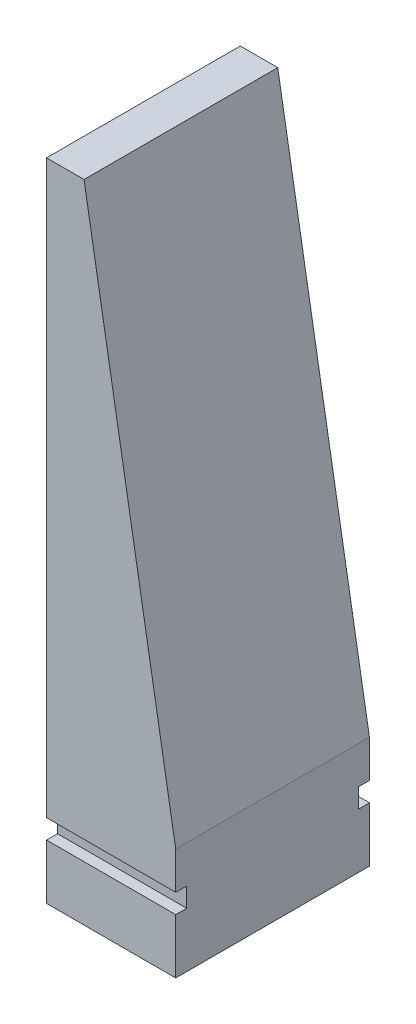
ISO-10303-21;
HEADER;
FILE_DESCRIPTION(('STEP AP214'),'2;1');
FILE_NAME('part.step','',(''),(''),'','','');
FILE_SCHEMA(('AUTOMOTIVE_DESIGN { 1 0 10303 214 1 1 1 1 }'));
ENDSEC;
DATA;
#1=APPLICATION_CONTEXT('core data for automotive mechanical design processes');
#2=APPLICATION_PROTOCOL_DEFINITION('international standard','automotive_design',2000,#1);
#3=PRODUCT_CONTEXT('',#1,'mechanical');
#4=PRODUCT('Part','Part','',(#3));
#5=PRODUCT_RELATED_PRODUCT_CATEGORY('part','',(#4));
#6=PRODUCT_DEFINITION_FORMATION('','',#4);
#7=PRODUCT_DEFINITION_CONTEXT('part definition',#1,'design');
#8=PRODUCT_DEFINITION('design','',#6,#7);
#9=PRODUCT_DEFINITION_SHAPE('','',#8);
#10=(LENGTH_UNIT() NAMED_UNIT(*) SI_UNIT(.MILLI.,.METRE.));
#11=(NAMED_UNIT(*) PLANE_ANGLE_UNIT() SI_UNIT($,.RADIAN.));
#12=(NAMED_UNIT(*) SI_UNIT($,.STERADIAN.) SOLID_ANGLE_UNIT());
#13=UNCERTAINTY_MEASURE_WITH_UNIT(LENGTH_MEASURE(1.E-05),#10,'distance_accuracy_value','');
#14=(GEOMETRIC_REPRESENTATION_CONTEXT(3) GLOBAL_UNCERTAINTY_ASSIGNED_CONTEXT((#13)) GLOBAL_UNIT_ASSIGNED_CONTEXT((#10,
#11,#12)) REPRESENTATION_CONTEXT('',''));
#15=CARTESIAN_POINT('',(0.,0.,0.));
#16=DIRECTION('',(0.,0.,1.));
#17=DIRECTION('',(1.,0.,0.));
#18=AXIS2_PLACEMENT_3D('',#15,#16,#17);
#19=CARTESIAN_POINT('',(10.,0.,-7.5));
#20=DIRECTION('',(0.,0.,1.));
#21=DIRECTION('',(1.,0.,0.));
#22=AXIS2_PLACEMENT_3D('',#19,#20,#21);
#23=PLANE('',#22);
#24=DIRECTION('',(0.,1.,0.));
#25=VECTOR('',#24,1.);
#26=CARTESIAN_POINT('',(0.,0.,-7.5));
#27=LINE('',#26,#25);
#28=CARTESIAN_POINT('',(0.,0.,-7.5));
#29=VERTEX_POINT('',#28);
#30=CARTESIAN_POINT('',(0.,4.25,-7.50000000000003));
#31=VERTEX_POINT('',#30);
#32=EDGE_CURVE('E151',#29,#31,#27,.T.);
#33=ORIENTED_EDGE('',*,*,#32,.T.);
#34=DIRECTION('',(1.,0.,0.));
#35=VECTOR('',#34,1.);
#36=CARTESIAN_POINT('',(0.,4.25,-7.50000000000003));
#37=LINE('',#36,#35);
#38=CARTESIAN_POINT('',(10.,4.25,-7.50000000000003));
#39=VERTEX_POINT('',#38);
#40=EDGE_CURVE('E196',#31,#39,#37,.T.);
#41=ORIENTED_EDGE('',*,*,#40,.T.);
#42=DIRECTION('',(0.,1.,0.));
#43=VECTOR('',#42,1.);
#44=CARTESIAN_POINT('',(10.,0.,-7.5));
#45=LINE('',#44,#43);
#46=CARTESIAN_POINT('',(10.,0.,-7.5));
#47=VERTEX_POINT('',#46);
#48=EDGE_CURVE('E229',#47,#39,#45,.T.);
#49=ORIENTED_EDGE('',*,*,#48,.F.);
#50=DIRECTION('',(-1.,0.,0.));
#51=VECTOR('',#50,1.);
#52=CARTESIAN_POINT('',(10.,0.,-7.5));
#53=LINE('',#52,#51);
#54=EDGE_CURVE('E169',#47,#29,#53,.T.);
#55=ORIENTED_EDGE('',*,*,#54,.T.);
#56=EDGE_LOOP('',(#33,#41,#49,#55));
#57=FACE_BOUND('',#56,.T.);
#58=ADVANCED_FACE('F36',(#57),#23,.F.);
#59=CARTESIAN_POINT('',(10.,0.,7.5));
#60=DIRECTION('',(0.,0.,-1.));
#61=DIRECTION('',(0.,1.,0.));
#62=AXIS2_PLACEMENT_3D('',#59,#60,#61);
#63=PLANE('',#62);
#64=DIRECTION('',(0.,-1.,0.));
#65=VECTOR('',#64,1.);
#66=CARTESIAN_POINT('',(10.,0.,7.5));
#67=LINE('',#66,#65);
#68=CARTESIAN_POINT('',(10.,8.64887318573436,7.50000000000001));
#69=VERTEX_POINT('',#68);
#70=CARTESIAN_POINT('',(10.,5.75,7.50000000000003));
#71=VERTEX_POINT('',#70);
#72=EDGE_CURVE('E179',#69,#71,#67,.T.);
#73=ORIENTED_EDGE('',*,*,#72,.F.);
#74=DIRECTION('',(0.169195593034637,-0.985582493400556,0.));
#75=VECTOR('',#74,1.);
#76=CARTESIAN_POINT('',(2.90122493973044,50.,7.5));
#77=LINE('',#76,#75);
#78=CARTESIAN_POINT('',(2.90122493973044,50.,7.5));
#79=VERTEX_POINT('',#78);
#80=EDGE_CURVE('E51',#79,#69,#77,.T.);
#81=ORIENTED_EDGE('',*,*,#80,.F.);
#82=DIRECTION('',(-1.,0.,0.));
#83=VECTOR('',#82,1.);
#84=CARTESIAN_POINT('',(10.,50.,7.50000000000003));
#85=LINE('',#84,#83);
#86=CARTESIAN_POINT('',(0.,50.,7.50000000000003));
#87=VERTEX_POINT('',#86);
#88=EDGE_CURVE('E44',#79,#87,#85,.T.);
#89=ORIENTED_EDGE('',*,*,#88,.T.);
#90=DIRECTION('',(0.,-1.,0.));
#91=VECTOR('',#90,1.);
#92=CARTESIAN_POINT('',(0.,0.,7.5));
#93=LINE('',#92,#91);
#94=CARTESIAN_POINT('',(0.,5.75,7.50000000000003));
#95=VERTEX_POINT('',#94);
#96=EDGE_CURVE('E159',#87,#95,#93,.T.);
#97=ORIENTED_EDGE('',*,*,#96,.T.);
#98=DIRECTION('',(1.,0.,0.));
#99=VECTOR('',#98,1.);
#100=CARTESIAN_POINT('',(0.,5.75,7.50000000000003));
#101=LINE('',#100,#99);
#102=EDGE_CURVE('E152',#95,#71,#101,.T.);
#103=ORIENTED_EDGE('',*,*,#102,.T.);
#104=EDGE_LOOP('',(#73,#81,#89,#97,#103));
#105=FACE_BOUND('',#104,.T.);
#106=ADVANCED_FACE('F177',(#105),#63,.F.);
#107=DIRECTION('',(-1.,0.,0.));
#108=VECTOR('',#107,1.);
#109=CARTESIAN_POINT('',(10.,50.,-7.5));
#110=LINE('',#109,#108);
#111=CARTESIAN_POINT('',(2.90122493973044,50.,-7.50000000000003));
#112=VERTEX_POINT('',#111);
#113=CARTESIAN_POINT('',(0.,50.,-7.5));
#114=VERTEX_POINT('',#113);
#115=EDGE_CURVE('E11',#112,#114,#110,.T.);
#116=ORIENTED_EDGE('',*,*,#115,.F.);
#117=DIRECTION('',(0.169195593034637,-0.985582493400556,0.));
#118=VECTOR('',#117,1.);
#119=CARTESIAN_POINT('',(2.90122493973044,50.,-7.50000000000003));
#120=LINE('',#119,#118);
#121=CARTESIAN_POINT('',(10.,8.64887318573437,-7.50000000000003));
#122=VERTEX_POINT('',#121);
#123=EDGE_CURVE('E128',#112,#122,#120,.T.);
#124=ORIENTED_EDGE('',*,*,#123,.T.);
#125=CARTESIAN_POINT('',(10.,5.75,-7.50000000000003));
#126=VERTEX_POINT('',#125);
#127=EDGE_CURVE('E168',#126,#122,#45,.T.);
#128=ORIENTED_EDGE('',*,*,#127,.F.);
#129=DIRECTION('',(1.,0.,0.));
#130=VECTOR('',#129,1.);
#131=CARTESIAN_POINT('',(0.,5.75,-7.50000000000003));
#132=LINE('',#131,#130);
#133=CARTESIAN_POINT('',(0.,5.75,-7.50000000000003));
#134=VERTEX_POINT('',#133);
#135=EDGE_CURVE('E148',#134,#126,#132,.T.);
#136=ORIENTED_EDGE('',*,*,#135,.F.);
#137=EDGE_CURVE('E146',#134,#114,#27,.T.);
#138=ORIENTED_EDGE('',*,*,#137,.T.);
#139=EDGE_LOOP('',(#116,#124,#128,#136,#138));
#140=FACE_BOUND('',#139,.T.);
#141=ADVANCED_FACE('F38',(#140),#23,.F.);
#142=CARTESIAN_POINT('',(10.,50.,-7.5));
#143=DIRECTION('',(0.,-1.,0.));
#144=DIRECTION('',(0.,0.,-1.));
#145=AXIS2_PLACEMENT_3D('',#142,#143,#144);
#146=PLANE('',#145);
#147=ORIENTED_EDGE('',*,*,#88,.F.);
#148=DIRECTION('',(0.,0.,1.));
#149=VECTOR('',#148,1.);
#150=CARTESIAN_POINT('',(2.90122493973044,50.,-7.50000000000003));
#151=LINE('',#150,#149);
#152=EDGE_CURVE('E131',#112,#79,#151,.T.);
#153=ORIENTED_EDGE('',*,*,#152,.F.);
#154=ORIENTED_EDGE('',*,*,#115,.T.);
#155=DIRECTION('',(0.,0.,1.));
#156=VECTOR('',#155,1.);
#157=CARTESIAN_POINT('',(0.,50.,-7.5));
#158=LINE('',#157,#156);
#159=EDGE_CURVE('E155',#114,#87,#158,.T.);
#160=ORIENTED_EDGE('',*,*,#159,.T.);
#161=EDGE_LOOP('',(#147,#153,#154,#160));
#162=FACE_BOUND('',#161,.T.);
#163=ADVANCED_FACE('F140',(#162),#146,.F.);
#164=CARTESIAN_POINT('',(10.,4.25,7.50000000000003));
#165=VERTEX_POINT('',#164);
#166=CARTESIAN_POINT('',(10.,0.,7.5));
#167=VERTEX_POINT('',#166);
#168=EDGE_CURVE('E232',#165,#167,#67,.T.);
#169=ORIENTED_EDGE('',*,*,#168,.F.);
#170=DIRECTION('',(1.,0.,0.));
#171=VECTOR('',#170,1.);
#172=CARTESIAN_POINT('',(0.,4.25,7.50000000000003));
#173=LINE('',#172,#171);
#174=CARTESIAN_POINT('',(0.,4.25,7.50000000000003));
#175=VERTEX_POINT('',#174);
#176=EDGE_CURVE('E191',#175,#165,#173,.T.);
#177=ORIENTED_EDGE('',*,*,#176,.F.);
#178=CARTESIAN_POINT('',(0.,0.,7.5));
#179=VERTEX_POINT('',#178);
#180=EDGE_CURVE('E160',#175,#179,#93,.T.);
#181=ORIENTED_EDGE('',*,*,#180,.T.);
#182=DIRECTION('',(-1.,0.,0.));
#183=VECTOR('',#182,1.);
#184=CARTESIAN_POINT('',(10.,0.,7.5));
#185=LINE('',#184,#183);
#186=EDGE_CURVE('E172',#167,#179,#185,.T.);
#187=ORIENTED_EDGE('',*,*,#186,.F.);
#188=EDGE_LOOP('',(#169,#177,#181,#187));
#189=FACE_BOUND('',#188,.T.);
#190=ADVANCED_FACE('F266',(#189),#63,.F.);
#191=CARTESIAN_POINT('',(10.,0.,-7.5));
#192=DIRECTION('',(0.,1.,0.));
#193=DIRECTION('',(0.,0.,1.));
#194=AXIS2_PLACEMENT_3D('',#191,#192,#193);
#195=PLANE('',#194);
#196=DIRECTION('',(0.,0.,-1.));
#197=VECTOR('',#196,1.);
#198=CARTESIAN_POINT('',(0.,0.,-7.5));
#199=LINE('',#198,#197);
#200=EDGE_CURVE('E166',#179,#29,#199,.T.);
#201=ORIENTED_EDGE('',*,*,#200,.T.);
#202=ORIENTED_EDGE('',*,*,#54,.F.);
#203=DIRECTION('',(0.,0.,-1.));
#204=VECTOR('',#203,1.);
#205=CARTESIAN_POINT('',(10.,0.,-7.5));
#206=LINE('',#205,#204);
#207=EDGE_CURVE('E173',#167,#47,#206,.T.);
#208=ORIENTED_EDGE('',*,*,#207,.F.);
#209=ORIENTED_EDGE('',*,*,#186,.T.);
#210=EDGE_LOOP('',(#201,#202,#208,#209));
#211=FACE_BOUND('',#210,.T.);
#212=ADVANCED_FACE('F243',(#211),#195,.F.);
#213=CARTESIAN_POINT('',(10.,0.,0.));
#214=DIRECTION('',(1.,0.,0.));
#215=DIRECTION('',(0.,0.,-1.));
#216=AXIS2_PLACEMENT_3D('',#213,#214,#215);
#217=PLANE('',#216);
#218=DIRECTION('',(0.,0.,1.));
#219=VECTOR('',#218,1.);
#220=CARTESIAN_POINT('',(10.,8.64887318573437,-7.50000000000003));
#221=LINE('',#220,#219);
#222=EDGE_CURVE('E132',#122,#69,#221,.T.);
#223=ORIENTED_EDGE('',*,*,#222,.T.);
#224=ORIENTED_EDGE('',*,*,#72,.T.);
#225=DIRECTION('',(0.,0.,1.));
#226=VECTOR('',#225,1.);
#227=CARTESIAN_POINT('',(10.,5.75,7.50000000000003));
#228=LINE('',#227,#226);
#229=CARTESIAN_POINT('',(10.,5.75,6.65000000000003));
#230=VERTEX_POINT('',#229);
#231=EDGE_CURVE('E187',#230,#71,#228,.T.);
#232=ORIENTED_EDGE('',*,*,#231,.F.);
#233=DIRECTION('',(0.,1.,0.));
#234=VECTOR('',#233,1.);
#235=CARTESIAN_POINT('',(10.,5.75,6.65000000000003));
#236=LINE('',#235,#234);
#237=CARTESIAN_POINT('',(10.,4.25,6.65));
#238=VERTEX_POINT('',#237);
#239=EDGE_CURVE('E195',#238,#230,#236,.T.);
#240=ORIENTED_EDGE('',*,*,#239,.F.);
#241=DIRECTION('',(0.,0.,-1.));
#242=VECTOR('',#241,1.);
#243=CARTESIAN_POINT('',(10.,4.25,6.65));
#244=LINE('',#243,#242);
#245=EDGE_CURVE('E192',#165,#238,#244,.T.);
#246=ORIENTED_EDGE('',*,*,#245,.F.);
#247=ORIENTED_EDGE('',*,*,#168,.T.);
#248=ORIENTED_EDGE('',*,*,#207,.T.);
#249=ORIENTED_EDGE('',*,*,#48,.T.);
#250=DIRECTION('',(0.,0.,-1.));
#251=VECTOR('',#250,1.);
#252=CARTESIAN_POINT('',(10.,4.25,-6.65));
#253=LINE('',#252,#251);
#254=CARTESIAN_POINT('',(10.,4.25,-6.65));
#255=VERTEX_POINT('',#254);
#256=EDGE_CURVE('E210',#255,#39,#253,.T.);
#257=ORIENTED_EDGE('',*,*,#256,.F.);
#258=DIRECTION('',(0.,-1.,0.));
#259=VECTOR('',#258,1.);
#260=CARTESIAN_POINT('',(10.,5.75,-6.65));
#261=LINE('',#260,#259);
#262=CARTESIAN_POINT('',(10.,5.75,-6.65));
#263=VERTEX_POINT('',#262);
#264=EDGE_CURVE('E218',#263,#255,#261,.T.);
#265=ORIENTED_EDGE('',*,*,#264,.F.);
#266=DIRECTION('',(0.,0.,1.));
#267=VECTOR('',#266,1.);
#268=CARTESIAN_POINT('',(10.,5.75,-7.50000000000003));
#269=LINE('',#268,#267);
#270=EDGE_CURVE('E182',#126,#263,#269,.T.);
#271=ORIENTED_EDGE('',*,*,#270,.F.);
#272=ORIENTED_EDGE('',*,*,#127,.T.);
#273=EDGE_LOOP('',(#223,#224,#232,#240,#246,#247,#248,#249,#257,#265,#271,#272));
#274=FACE_BOUND('',#273,.T.);
#275=ADVANCED_FACE('F236',(#274),#217,.T.);
#276=CARTESIAN_POINT('',(0.,0.,0.));
#277=DIRECTION('',(1.,0.,0.));
#278=DIRECTION('',(0.,0.,-1.));
#279=AXIS2_PLACEMENT_3D('',#276,#277,#278);
#280=PLANE('',#279);
#281=DIRECTION('',(0.,1.,0.));
#282=VECTOR('',#281,1.);
#283=CARTESIAN_POINT('',(0.,5.75,6.65000000000003));
#284=LINE('',#283,#282);
#285=CARTESIAN_POINT('',(0.,4.25,6.65));
#286=VERTEX_POINT('',#285);
#287=CARTESIAN_POINT('',(0.,5.75,6.65000000000003));
#288=VERTEX_POINT('',#287);
#289=EDGE_CURVE('E59',#286,#288,#284,.T.);
#290=ORIENTED_EDGE('',*,*,#289,.T.);
#291=DIRECTION('',(0.,0.,1.));
#292=VECTOR('',#291,1.);
#293=CARTESIAN_POINT('',(0.,5.75,7.50000000000003));
#294=LINE('',#293,#292);
#295=EDGE_CURVE('E189',#288,#95,#294,.T.);
#296=ORIENTED_EDGE('',*,*,#295,.T.);
#297=ORIENTED_EDGE('',*,*,#96,.F.);
#298=ORIENTED_EDGE('',*,*,#159,.F.);
#299=ORIENTED_EDGE('',*,*,#137,.F.);
#300=DIRECTION('',(0.,0.,1.));
#301=VECTOR('',#300,1.);
#302=CARTESIAN_POINT('',(0.,5.75,-7.50000000000003));
#303=LINE('',#302,#301);
#304=CARTESIAN_POINT('',(0.,5.75,-6.65));
#305=VERTEX_POINT('',#304);
#306=EDGE_CURVE('E207',#134,#305,#303,.T.);
#307=ORIENTED_EDGE('',*,*,#306,.T.);
#308=DIRECTION('',(0.,-1.,0.));
#309=VECTOR('',#308,1.);
#310=CARTESIAN_POINT('',(0.,5.75,-6.65));
#311=LINE('',#310,#309);
#312=CARTESIAN_POINT('',(0.,4.25,-6.65));
#313=VERTEX_POINT('',#312);
#314=EDGE_CURVE('E209',#305,#313,#311,.T.);
#315=ORIENTED_EDGE('',*,*,#314,.T.);
#316=DIRECTION('',(0.,0.,-1.));
#317=VECTOR('',#316,1.);
#318=CARTESIAN_POINT('',(0.,4.25,-6.65));
#319=LINE('',#318,#317);
#320=EDGE_CURVE('E213',#313,#31,#319,.T.);
#321=ORIENTED_EDGE('',*,*,#320,.T.);
#322=ORIENTED_EDGE('',*,*,#32,.F.);
#323=ORIENTED_EDGE('',*,*,#200,.F.);
#324=ORIENTED_EDGE('',*,*,#180,.F.);
#325=DIRECTION('',(0.,0.,-1.));
#326=VECTOR('',#325,1.);
#327=CARTESIAN_POINT('',(0.,4.25,6.65));
#328=LINE('',#327,#326);
#329=EDGE_CURVE('E184',#175,#286,#328,.T.);
#330=ORIENTED_EDGE('',*,*,#329,.T.);
#331=EDGE_LOOP('',(#290,#296,#297,#298,#299,#307,#315,#321,#322,#323,#324,#330));
#332=FACE_BOUND('',#331,.T.);
#333=ADVANCED_FACE('F156',(#332),#280,.F.);
#334=CARTESIAN_POINT('',(0.,4.25,-6.65));
#335=DIRECTION('',(0.,-1.,0.));
#336=DIRECTION('',(0.,0.,-1.));
#337=AXIS2_PLACEMENT_3D('',#334,#335,#336);
#338=PLANE('',#337);
#339=ORIENTED_EDGE('',*,*,#256,.T.);
#340=ORIENTED_EDGE('',*,*,#40,.F.);
#341=ORIENTED_EDGE('',*,*,#320,.F.);
#342=DIRECTION('',(1.,0.,0.));
#343=VECTOR('',#342,1.);
#344=CARTESIAN_POINT('',(0.,4.25,-6.65));
#345=LINE('',#344,#343);
#346=EDGE_CURVE('E224',#313,#255,#345,.T.);
#347=ORIENTED_EDGE('',*,*,#346,.T.);
#348=EDGE_LOOP('',(#339,#340,#341,#347));
#349=FACE_BOUND('',#348,.T.);
#350=ADVANCED_FACE('F249',(#349),#338,.F.);
#351=CARTESIAN_POINT('',(0.,5.75,-6.65));
#352=DIRECTION('',(0.,0.,1.));
#353=DIRECTION('',(1.,0.,0.));
#354=AXIS2_PLACEMENT_3D('',#351,#352,#353);
#355=PLANE('',#354);
#356=ORIENTED_EDGE('',*,*,#264,.T.);
#357=ORIENTED_EDGE('',*,*,#346,.F.);
#358=ORIENTED_EDGE('',*,*,#314,.F.);
#359=DIRECTION('',(1.,0.,0.));
#360=VECTOR('',#359,1.);
#361=CARTESIAN_POINT('',(0.,5.75,-6.65));
#362=LINE('',#361,#360);
#363=EDGE_CURVE('E226',#305,#263,#362,.T.);
#364=ORIENTED_EDGE('',*,*,#363,.T.);
#365=EDGE_LOOP('',(#356,#357,#358,#364));
#366=FACE_BOUND('',#365,.T.);
#367=ADVANCED_FACE('F252',(#366),#355,.F.);
#368=CARTESIAN_POINT('',(0.,5.75,-7.50000000000003));
#369=DIRECTION('',(0.,1.,0.));
#370=DIRECTION('',(0.,0.,1.));
#371=AXIS2_PLACEMENT_3D('',#368,#369,#370);
#372=PLANE('',#371);
#373=ORIENTED_EDGE('',*,*,#270,.T.);
#374=ORIENTED_EDGE('',*,*,#363,.F.);
#375=ORIENTED_EDGE('',*,*,#306,.F.);
#376=ORIENTED_EDGE('',*,*,#135,.T.);
#377=EDGE_LOOP('',(#373,#374,#375,#376));
#378=FACE_BOUND('',#377,.T.);
#379=ADVANCED_FACE('F254',(#378),#372,.F.);
#380=CARTESIAN_POINT('',(0.,5.75,7.50000000000003));
#381=DIRECTION('',(0.,1.,0.));
#382=DIRECTION('',(0.,0.,1.));
#383=AXIS2_PLACEMENT_3D('',#380,#381,#382);
#384=PLANE('',#383);
#385=ORIENTED_EDGE('',*,*,#231,.T.);
#386=ORIENTED_EDGE('',*,*,#102,.F.);
#387=ORIENTED_EDGE('',*,*,#295,.F.);
#388=DIRECTION('',(1.,0.,0.));
#389=VECTOR('',#388,1.);
#390=CARTESIAN_POINT('',(0.,5.75,6.65000000000003));
#391=LINE('',#390,#389);
#392=EDGE_CURVE('E202',#288,#230,#391,.T.);
#393=ORIENTED_EDGE('',*,*,#392,.T.);
#394=EDGE_LOOP('',(#385,#386,#387,#393));
#395=FACE_BOUND('',#394,.T.);
#396=ADVANCED_FACE('F260',(#395),#384,.F.);
#397=CARTESIAN_POINT('',(0.,5.75,6.65000000000003));
#398=DIRECTION('',(0.,0.,-1.));
#399=DIRECTION('',(0.,1.,0.));
#400=AXIS2_PLACEMENT_3D('',#397,#398,#399);
#401=PLANE('',#400);
#402=ORIENTED_EDGE('',*,*,#239,.T.);
#403=ORIENTED_EDGE('',*,*,#392,.F.);
#404=ORIENTED_EDGE('',*,*,#289,.F.);
#405=DIRECTION('',(1.,0.,0.));
#406=VECTOR('',#405,1.);
#407=CARTESIAN_POINT('',(0.,4.25,6.65));
#408=LINE('',#407,#406);
#409=EDGE_CURVE('E204',#286,#238,#408,.T.);
#410=ORIENTED_EDGE('',*,*,#409,.T.);
#411=EDGE_LOOP('',(#402,#403,#404,#410));
#412=FACE_BOUND('',#411,.T.);
#413=ADVANCED_FACE('F262',(#412),#401,.F.);
#414=CARTESIAN_POINT('',(0.,4.25,6.65));
#415=DIRECTION('',(0.,-1.,0.));
#416=DIRECTION('',(0.,0.,-1.));
#417=AXIS2_PLACEMENT_3D('',#414,#415,#416);
#418=PLANE('',#417);
#419=ORIENTED_EDGE('',*,*,#245,.T.);
#420=ORIENTED_EDGE('',*,*,#409,.F.);
#421=ORIENTED_EDGE('',*,*,#329,.F.);
#422=ORIENTED_EDGE('',*,*,#176,.T.);
#423=EDGE_LOOP('',(#419,#420,#421,#422));
#424=FACE_BOUND('',#423,.T.);
#425=ADVANCED_FACE('F268',(#424),#418,.F.);
#426=CARTESIAN_POINT('',(2.90122493973044,50.,-7.50000000000003));
#427=DIRECTION('',(-0.985582493400556,-0.169195593034637,0.));
#428=DIRECTION('',(0.169195593034637,-0.985582493400556,0.));
#429=AXIS2_PLACEMENT_3D('',#426,#427,#428);
#430=PLANE('',#429);
#431=ORIENTED_EDGE('',*,*,#80,.T.);
#432=ORIENTED_EDGE('',*,*,#222,.F.);
#433=ORIENTED_EDGE('',*,*,#123,.F.);
#434=ORIENTED_EDGE('',*,*,#152,.T.);
#435=EDGE_LOOP('',(#431,#432,#433,#434));
#436=FACE_BOUND('',#435,.T.);
#437=ADVANCED_FACE('F130',(#436),#430,.F.);
#438=CLOSED_SHELL('',(#58,#106,#141,#163,#190,#212,#275,#333,#350,#367,#379,#396,#413,#425,#437));
#439=MANIFOLD_SOLID_BREP('B2',#438);
#440=ADVANCED_BREP_SHAPE_REPRESENTATION('',(#18,#439),#14);
#441=SHAPE_DEFINITION_REPRESENTATION(#9,#440);
ENDSEC;
END-ISO-10303-21;
